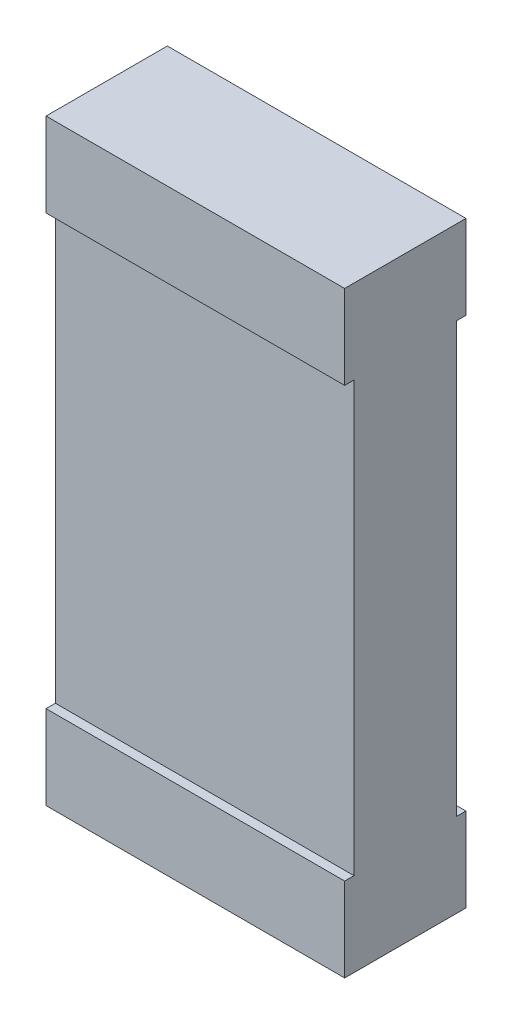
ISO-10303-21;
HEADER;
FILE_DESCRIPTION(('STEP AP214'),'2;1');
FILE_NAME('part.step','',(''),(''),'','','');
FILE_SCHEMA(('AUTOMOTIVE_DESIGN { 1 0 10303 214 1 1 1 1 }'));
ENDSEC;
DATA;
#1=APPLICATION_CONTEXT('core data for automotive mechanical design processes');
#2=APPLICATION_PROTOCOL_DEFINITION('international standard','automotive_design',2000,#1);
#3=PRODUCT_CONTEXT('',#1,'mechanical');
#4=PRODUCT('Part','Part','',(#3));
#5=PRODUCT_RELATED_PRODUCT_CATEGORY('part','',(#4));
#6=PRODUCT_DEFINITION_FORMATION('','',#4);
#7=PRODUCT_DEFINITION_CONTEXT('part definition',#1,'design');
#8=PRODUCT_DEFINITION('design','',#6,#7);
#9=PRODUCT_DEFINITION_SHAPE('','',#8);
#10=(LENGTH_UNIT() NAMED_UNIT(*) SI_UNIT(.MILLI.,.METRE.));
#11=(NAMED_UNIT(*) PLANE_ANGLE_UNIT() SI_UNIT($,.RADIAN.));
#12=(NAMED_UNIT(*) SI_UNIT($,.STERADIAN.) SOLID_ANGLE_UNIT());
#13=UNCERTAINTY_MEASURE_WITH_UNIT(LENGTH_MEASURE(1.E-05),#10,'distance_accuracy_value','');
#14=(GEOMETRIC_REPRESENTATION_CONTEXT(3) GLOBAL_UNCERTAINTY_ASSIGNED_CONTEXT((#13)) GLOBAL_UNIT_ASSIGNED_CONTEXT((#10,
#11,#12)) REPRESENTATION_CONTEXT('',''));
#15=CARTESIAN_POINT('',(0.,0.,0.));
#16=DIRECTION('',(0.,0.,1.));
#17=DIRECTION('',(1.,0.,0.));
#18=AXIS2_PLACEMENT_3D('',#15,#16,#17);
#19=CARTESIAN_POINT('',(-0.8,0.,0.65));
#20=DIRECTION('',(0.,0.,1.));
#21=DIRECTION('',(1.,0.,0.));
#22=AXIS2_PLACEMENT_3D('',#19,#20,#21);
#23=PLANE('',#22);
#24=DIRECTION('',(1.,0.,0.));
#25=VECTOR('',#24,1.);
#26=CARTESIAN_POINT('',(-0.800000000000001,3.2,0.65));
#27=LINE('',#26,#25);
#28=CARTESIAN_POINT('',(0.800000000000001,3.2,0.65));
#29=VERTEX_POINT('',#28);
#30=CARTESIAN_POINT('',(-0.800000000000001,3.2,0.65));
#31=VERTEX_POINT('',#30);
#32=EDGE_CURVE('E116',#29,#31,#27,.F.);
#33=ORIENTED_EDGE('',*,*,#32,.T.);
#34=DIRECTION('',(0.,1.,0.));
#35=VECTOR('',#34,1.);
#36=CARTESIAN_POINT('',(-0.800000000000001,0.,0.65));
#37=LINE('',#36,#35);
#38=CARTESIAN_POINT('',(-0.800000000000001,2.75,0.65));
#39=VERTEX_POINT('',#38);
#40=EDGE_CURVE('E102',#31,#39,#37,.F.);
#41=ORIENTED_EDGE('',*,*,#40,.T.);
#42=DIRECTION('',(1.,0.,0.));
#43=VECTOR('',#42,1.);
#44=CARTESIAN_POINT('',(-0.800000000000001,2.75,0.65));
#45=LINE('',#44,#43);
#46=CARTESIAN_POINT('',(0.800000000000001,2.75,0.65));
#47=VERTEX_POINT('',#46);
#48=EDGE_CURVE('E122',#39,#47,#45,.T.);
#49=ORIENTED_EDGE('',*,*,#48,.T.);
#50=DIRECTION('',(0.,1.,0.));
#51=VECTOR('',#50,1.);
#52=CARTESIAN_POINT('',(0.800000000000001,0.,0.65));
#53=LINE('',#52,#51);
#54=EDGE_CURVE('E19',#47,#29,#53,.T.);
#55=ORIENTED_EDGE('',*,*,#54,.T.);
#56=EDGE_LOOP('',(#33,#41,#49,#55));
#57=FACE_BOUND('',#56,.T.);
#58=ADVANCED_FACE('F16',(#57),#23,.T.);
#59=CARTESIAN_POINT('',(-0.8,0.,0.65));
#60=DIRECTION('',(0.,0.,1.));
#61=DIRECTION('',(1.,0.,0.));
#62=AXIS2_PLACEMENT_3D('',#59,#60,#61);
#63=PLANE('',#62);
#64=DIRECTION('',(1.,0.,0.));
#65=VECTOR('',#64,1.);
#66=CARTESIAN_POINT('',(-0.8,0.,0.65));
#67=LINE('',#66,#65);
#68=CARTESIAN_POINT('',(-0.800000000000001,0.,0.65));
#69=VERTEX_POINT('',#68);
#70=CARTESIAN_POINT('',(0.8,0.,0.65));
#71=VERTEX_POINT('',#70);
#72=EDGE_CURVE('E166',#69,#71,#67,.T.);
#73=ORIENTED_EDGE('',*,*,#72,.T.);
#74=DIRECTION('',(0.,1.,0.));
#75=VECTOR('',#74,1.);
#76=CARTESIAN_POINT('',(0.8,0.,0.65));
#77=LINE('',#76,#75);
#78=CARTESIAN_POINT('',(0.8,0.45,0.65));
#79=VERTEX_POINT('',#78);
#80=EDGE_CURVE('E117',#71,#79,#77,.T.);
#81=ORIENTED_EDGE('',*,*,#80,.T.);
#82=DIRECTION('',(1.,0.,0.));
#83=VECTOR('',#82,1.);
#84=CARTESIAN_POINT('',(-0.800000000000001,0.45,0.65));
#85=LINE('',#84,#83);
#86=CARTESIAN_POINT('',(-0.800000000000001,0.45,0.65));
#87=VERTEX_POINT('',#86);
#88=EDGE_CURVE('E150',#79,#87,#85,.F.);
#89=ORIENTED_EDGE('',*,*,#88,.T.);
#90=DIRECTION('',(0.,1.,0.));
#91=VECTOR('',#90,1.);
#92=CARTESIAN_POINT('',(-0.800000000000001,0.,0.65));
#93=LINE('',#92,#91);
#94=EDGE_CURVE('E133',#87,#69,#93,.F.);
#95=ORIENTED_EDGE('',*,*,#94,.T.);
#96=EDGE_LOOP('',(#73,#81,#89,#95));
#97=FACE_BOUND('',#96,.T.);
#98=ADVANCED_FACE('F163',(#97),#63,.T.);
#99=CARTESIAN_POINT('',(-0.800000000000001,3.2,0.65));
#100=DIRECTION('',(0.,-1.,0.));
#101=DIRECTION('',(0.,0.,-1.));
#102=AXIS2_PLACEMENT_3D('',#99,#100,#101);
#103=PLANE('',#102);
#104=DIRECTION('',(0.,0.,-1.));
#105=VECTOR('',#104,1.);
#106=CARTESIAN_POINT('',(-0.800000000000001,3.2,0.65));
#107=LINE('',#106,#105);
#108=CARTESIAN_POINT('',(-0.800000000000001,3.2,0.));
#109=VERTEX_POINT('',#108);
#110=EDGE_CURVE('E125',#31,#109,#107,.T.);
#111=ORIENTED_EDGE('',*,*,#110,.F.);
#112=ORIENTED_EDGE('',*,*,#32,.F.);
#113=DIRECTION('',(0.,0.,-1.));
#114=VECTOR('',#113,1.);
#115=CARTESIAN_POINT('',(0.800000000000001,3.2,0.65));
#116=LINE('',#115,#114);
#117=CARTESIAN_POINT('',(0.800000000000001,3.2,0.));
#118=VERTEX_POINT('',#117);
#119=EDGE_CURVE('E106',#118,#29,#116,.F.);
#120=ORIENTED_EDGE('',*,*,#119,.F.);
#121=DIRECTION('',(1.,0.,0.));
#122=VECTOR('',#121,1.);
#123=CARTESIAN_POINT('',(-0.8,3.2,0.));
#124=LINE('',#123,#122);
#125=EDGE_CURVE('E177',#118,#109,#124,.F.);
#126=ORIENTED_EDGE('',*,*,#125,.T.);
#127=EDGE_LOOP('',(#111,#112,#120,#126));
#128=FACE_BOUND('',#127,.T.);
#129=ADVANCED_FACE('F124',(#128),#103,.F.);
#130=CARTESIAN_POINT('',(-0.800000000000001,0.45,1.04939769162652));
#131=DIRECTION('',(0.,-1.,0.));
#132=DIRECTION('',(0.,0.,-1.));
#133=AXIS2_PLACEMENT_3D('',#130,#131,#132);
#134=PLANE('',#133);
#135=DIRECTION('',(0.,0.,-1.));
#136=VECTOR('',#135,1.);
#137=CARTESIAN_POINT('',(-0.800000000000001,0.45,1.04939769162652));
#138=LINE('',#137,#136);
#139=CARTESIAN_POINT('',(-0.800000000000001,0.45,0.6));
#140=VERTEX_POINT('',#139);
#141=EDGE_CURVE('E147',#87,#140,#138,.T.);
#142=ORIENTED_EDGE('',*,*,#141,.F.);
#143=ORIENTED_EDGE('',*,*,#88,.F.);
#144=DIRECTION('',(0.,0.,-1.));
#145=VECTOR('',#144,1.);
#146=CARTESIAN_POINT('',(0.8,0.45,1.04939769162652));
#147=LINE('',#146,#145);
#148=CARTESIAN_POINT('',(0.8,0.45,0.6));
#149=VERTEX_POINT('',#148);
#150=EDGE_CURVE('E127',#149,#79,#147,.F.);
#151=ORIENTED_EDGE('',*,*,#150,.F.);
#152=DIRECTION('',(1.,0.,0.));
#153=VECTOR('',#152,1.);
#154=CARTESIAN_POINT('',(-3.16484671807709,0.45,0.6));
#155=LINE('',#154,#153);
#156=EDGE_CURVE('E169',#140,#149,#155,.T.);
#157=ORIENTED_EDGE('',*,*,#156,.F.);
#158=EDGE_LOOP('',(#142,#143,#151,#157));
#159=FACE_BOUND('',#158,.T.);
#160=ADVANCED_FACE('F168',(#159),#134,.F.);
#161=CARTESIAN_POINT('',(-0.800000000000001,2.75,1.04939769162652));
#162=DIRECTION('',(0.,1.,0.));
#163=DIRECTION('',(0.,0.,1.));
#164=AXIS2_PLACEMENT_3D('',#161,#162,#163);
#165=PLANE('',#164);
#166=DIRECTION('',(1.,0.,0.));
#167=VECTOR('',#166,1.);
#168=CARTESIAN_POINT('',(-3.16484671807709,2.75,0.6));
#169=LINE('',#168,#167);
#170=CARTESIAN_POINT('',(0.800000000000001,2.75,0.6));
#171=VERTEX_POINT('',#170);
#172=CARTESIAN_POINT('',(-0.800000000000001,2.75,0.6));
#173=VERTEX_POINT('',#172);
#174=EDGE_CURVE('E184',#171,#173,#169,.F.);
#175=ORIENTED_EDGE('',*,*,#174,.F.);
#176=DIRECTION('',(0.,0.,1.));
#177=VECTOR('',#176,1.);
#178=CARTESIAN_POINT('',(0.800000000000001,2.75,1.04939769162652));
#179=LINE('',#178,#177);
#180=EDGE_CURVE('E144',#47,#171,#179,.F.);
#181=ORIENTED_EDGE('',*,*,#180,.F.);
#182=ORIENTED_EDGE('',*,*,#48,.F.);
#183=DIRECTION('',(0.,0.,1.));
#184=VECTOR('',#183,1.);
#185=CARTESIAN_POINT('',(-0.800000000000001,2.75,1.04939769162652));
#186=LINE('',#185,#184);
#187=EDGE_CURVE('E136',#173,#39,#186,.T.);
#188=ORIENTED_EDGE('',*,*,#187,.F.);
#189=EDGE_LOOP('',(#175,#181,#182,#188));
#190=FACE_BOUND('',#189,.T.);
#191=ADVANCED_FACE('F146',(#190),#165,.F.);
#192=CARTESIAN_POINT('',(-0.8,0.,0.65));
#193=DIRECTION('',(0.,1.,0.));
#194=DIRECTION('',(0.,0.,1.));
#195=AXIS2_PLACEMENT_3D('',#192,#193,#194);
#196=PLANE('',#195);
#197=DIRECTION('',(0.,0.,1.));
#198=VECTOR('',#197,1.);
#199=CARTESIAN_POINT('',(0.8,0.,0.65));
#200=LINE('',#199,#198);
#201=CARTESIAN_POINT('',(0.8,0.,0.));
#202=VERTEX_POINT('',#201);
#203=EDGE_CURVE('E175',#71,#202,#200,.F.);
#204=ORIENTED_EDGE('',*,*,#203,.F.);
#205=ORIENTED_EDGE('',*,*,#72,.F.);
#206=DIRECTION('',(0.,0.,1.));
#207=VECTOR('',#206,1.);
#208=CARTESIAN_POINT('',(-0.8,0.,0.65));
#209=LINE('',#208,#207);
#210=CARTESIAN_POINT('',(-0.8,0.,0.));
#211=VERTEX_POINT('',#210);
#212=EDGE_CURVE('E143',#211,#69,#209,.T.);
#213=ORIENTED_EDGE('',*,*,#212,.F.);
#214=DIRECTION('',(1.,0.,0.));
#215=VECTOR('',#214,1.);
#216=CARTESIAN_POINT('',(-0.8,0.,0.));
#217=LINE('',#216,#215);
#218=EDGE_CURVE('E186',#211,#202,#217,.T.);
#219=ORIENTED_EDGE('',*,*,#218,.T.);
#220=EDGE_LOOP('',(#204,#205,#213,#219));
#221=FACE_BOUND('',#220,.T.);
#222=ADVANCED_FACE('F172',(#221),#196,.F.);
#223=CARTESIAN_POINT('',(-0.8,0.,0.));
#224=DIRECTION('',(0.,0.,1.));
#225=DIRECTION('',(1.,0.,0.));
#226=AXIS2_PLACEMENT_3D('',#223,#224,#225);
#227=PLANE('',#226);
#228=DIRECTION('',(1.,0.,0.));
#229=VECTOR('',#228,1.);
#230=CARTESIAN_POINT('',(-0.800000000000001,2.75,0.));
#231=LINE('',#230,#229);
#232=CARTESIAN_POINT('',(0.800000000000001,2.75,0.));
#233=VERTEX_POINT('',#232);
#234=CARTESIAN_POINT('',(-0.800000000000001,2.75,0.));
#235=VERTEX_POINT('',#234);
#236=EDGE_CURVE('E194',#233,#235,#231,.F.);
#237=ORIENTED_EDGE('',*,*,#236,.T.);
#238=DIRECTION('',(0.,1.,0.));
#239=VECTOR('',#238,1.);
#240=CARTESIAN_POINT('',(-0.800000000000001,3.2,0.));
#241=LINE('',#240,#239);
#242=EDGE_CURVE('E190',#235,#109,#241,.T.);
#243=ORIENTED_EDGE('',*,*,#242,.T.);
#244=ORIENTED_EDGE('',*,*,#125,.F.);
#245=DIRECTION('',(0.,1.,0.));
#246=VECTOR('',#245,1.);
#247=CARTESIAN_POINT('',(0.800000000000001,0.,0.));
#248=LINE('',#247,#246);
#249=EDGE_CURVE('E111',#233,#118,#248,.T.);
#250=ORIENTED_EDGE('',*,*,#249,.F.);
#251=EDGE_LOOP('',(#237,#243,#244,#250));
#252=FACE_BOUND('',#251,.T.);
#253=ADVANCED_FACE('F226',(#252),#227,.F.);
#254=CARTESIAN_POINT('',(-3.16484671807709,0.45,0.6));
#255=DIRECTION('',(0.,0.,1.));
#256=DIRECTION('',(1.,0.,0.));
#257=AXIS2_PLACEMENT_3D('',#254,#255,#256);
#258=PLANE('',#257);
#259=DIRECTION('',(0.,-1.,0.));
#260=VECTOR('',#259,1.);
#261=CARTESIAN_POINT('',(0.800000000000001,3.2,0.6));
#262=LINE('',#261,#260);
#263=EDGE_CURVE('E157',#149,#171,#262,.F.);
#264=ORIENTED_EDGE('',*,*,#263,.T.);
#265=ORIENTED_EDGE('',*,*,#174,.T.);
#266=DIRECTION('',(0.,1.,0.));
#267=VECTOR('',#266,1.);
#268=CARTESIAN_POINT('',(-0.800000000000001,3.2,0.6));
#269=LINE('',#268,#267);
#270=EDGE_CURVE('E139',#173,#140,#269,.F.);
#271=ORIENTED_EDGE('',*,*,#270,.T.);
#272=ORIENTED_EDGE('',*,*,#156,.T.);
#273=EDGE_LOOP('',(#264,#265,#271,#272));
#274=FACE_BOUND('',#273,.T.);
#275=ADVANCED_FACE('F234',(#274),#258,.T.);
#276=CARTESIAN_POINT('',(-0.8,0.,0.));
#277=DIRECTION('',(0.,0.,1.));
#278=DIRECTION('',(1.,0.,0.));
#279=AXIS2_PLACEMENT_3D('',#276,#277,#278);
#280=PLANE('',#279);
#281=DIRECTION('',(1.,0.,0.));
#282=VECTOR('',#281,1.);
#283=CARTESIAN_POINT('',(-0.800000000000001,0.45,0.));
#284=LINE('',#283,#282);
#285=CARTESIAN_POINT('',(-0.800000000000001,0.45,0.));
#286=VERTEX_POINT('',#285);
#287=CARTESIAN_POINT('',(0.8,0.45,0.));
#288=VERTEX_POINT('',#287);
#289=EDGE_CURVE('E204',#286,#288,#284,.T.);
#290=ORIENTED_EDGE('',*,*,#289,.T.);
#291=DIRECTION('',(0.,-1.,0.));
#292=VECTOR('',#291,1.);
#293=CARTESIAN_POINT('',(0.800000000000001,3.2,0.));
#294=LINE('',#293,#292);
#295=EDGE_CURVE('E201',#288,#202,#294,.T.);
#296=ORIENTED_EDGE('',*,*,#295,.T.);
#297=ORIENTED_EDGE('',*,*,#218,.F.);
#298=DIRECTION('',(0.,1.,0.));
#299=VECTOR('',#298,1.);
#300=CARTESIAN_POINT('',(-0.800000000000001,3.2,0.));
#301=LINE('',#300,#299);
#302=EDGE_CURVE('E188',#211,#286,#301,.T.);
#303=ORIENTED_EDGE('',*,*,#302,.T.);
#304=EDGE_LOOP('',(#290,#296,#297,#303));
#305=FACE_BOUND('',#304,.T.);
#306=ADVANCED_FACE('F232',(#305),#280,.F.);
#307=CARTESIAN_POINT('',(-0.800000000000001,3.2,0.65));
#308=DIRECTION('',(1.,0.,0.));
#309=DIRECTION('',(0.,1.,0.));
#310=AXIS2_PLACEMENT_3D('',#307,#308,#309);
#311=PLANE('',#310);
#312=ORIENTED_EDGE('',*,*,#141,.T.);
#313=ORIENTED_EDGE('',*,*,#270,.F.);
#314=ORIENTED_EDGE('',*,*,#187,.T.);
#315=ORIENTED_EDGE('',*,*,#40,.F.);
#316=ORIENTED_EDGE('',*,*,#110,.T.);
#317=ORIENTED_EDGE('',*,*,#242,.F.);
#318=DIRECTION('',(0.,0.,1.));
#319=VECTOR('',#318,1.);
#320=CARTESIAN_POINT('',(-0.800000000000001,2.75,1.04939769162652));
#321=LINE('',#320,#319);
#322=CARTESIAN_POINT('',(-0.800000000000001,2.75,0.0499999999999999));
#323=VERTEX_POINT('',#322);
#324=EDGE_CURVE('E196',#235,#323,#321,.T.);
#325=ORIENTED_EDGE('',*,*,#324,.T.);
#326=DIRECTION('',(0.,1.,0.));
#327=VECTOR('',#326,1.);
#328=CARTESIAN_POINT('',(-0.800000000000001,0.45,0.05));
#329=LINE('',#328,#327);
#330=CARTESIAN_POINT('',(-0.800000000000001,0.45,0.0499999999999999));
#331=VERTEX_POINT('',#330);
#332=EDGE_CURVE('E210',#331,#323,#329,.T.);
#333=ORIENTED_EDGE('',*,*,#332,.F.);
#334=DIRECTION('',(0.,0.,-1.));
#335=VECTOR('',#334,1.);
#336=CARTESIAN_POINT('',(-0.800000000000001,0.45,1.04939769162652));
#337=LINE('',#336,#335);
#338=EDGE_CURVE('E207',#331,#286,#337,.T.);
#339=ORIENTED_EDGE('',*,*,#338,.T.);
#340=ORIENTED_EDGE('',*,*,#302,.F.);
#341=ORIENTED_EDGE('',*,*,#212,.T.);
#342=ORIENTED_EDGE('',*,*,#94,.F.);
#343=EDGE_LOOP('',(#312,#313,#314,#315,#316,#317,#325,#333,#339,#340,#341,#342));
#344=FACE_BOUND('',#343,.T.);
#345=ADVANCED_FACE('F137',(#344),#311,.F.);
#346=CARTESIAN_POINT('',(-0.800000000000001,2.75,1.04939769162652));
#347=DIRECTION('',(0.,1.,0.));
#348=DIRECTION('',(0.,0.,1.));
#349=AXIS2_PLACEMENT_3D('',#346,#347,#348);
#350=PLANE('',#349);
#351=ORIENTED_EDGE('',*,*,#324,.F.);
#352=ORIENTED_EDGE('',*,*,#236,.F.);
#353=DIRECTION('',(0.,0.,1.));
#354=VECTOR('',#353,1.);
#355=CARTESIAN_POINT('',(0.800000000000001,2.75,0.65));
#356=LINE('',#355,#354);
#357=CARTESIAN_POINT('',(0.800000000000001,2.75,0.05));
#358=VERTEX_POINT('',#357);
#359=EDGE_CURVE('E199',#233,#358,#356,.T.);
#360=ORIENTED_EDGE('',*,*,#359,.T.);
#361=DIRECTION('',(1.,0.,0.));
#362=VECTOR('',#361,1.);
#363=CARTESIAN_POINT('',(-3.16484671807709,2.75,0.05));
#364=LINE('',#363,#362);
#365=EDGE_CURVE('E213',#323,#358,#364,.T.);
#366=ORIENTED_EDGE('',*,*,#365,.F.);
#367=EDGE_LOOP('',(#351,#352,#360,#366));
#368=FACE_BOUND('',#367,.T.);
#369=ADVANCED_FACE('F223',(#368),#350,.F.);
#370=CARTESIAN_POINT('',(0.800000000000001,3.2,0.65));
#371=DIRECTION('',(-1.,0.,0.));
#372=DIRECTION('',(0.,-1.,0.));
#373=AXIS2_PLACEMENT_3D('',#370,#371,#372);
#374=PLANE('',#373);
#375=DIRECTION('',(0.,0.,-1.));
#376=VECTOR('',#375,1.);
#377=CARTESIAN_POINT('',(0.8,0.45,1.04939769162652));
#378=LINE('',#377,#376);
#379=CARTESIAN_POINT('',(0.800000000000001,0.45,0.05));
#380=VERTEX_POINT('',#379);
#381=EDGE_CURVE('E34',#288,#380,#378,.F.);
#382=ORIENTED_EDGE('',*,*,#381,.T.);
#383=DIRECTION('',(0.,1.,0.));
#384=VECTOR('',#383,1.);
#385=CARTESIAN_POINT('',(0.800000000000001,0.45,0.05));
#386=LINE('',#385,#384);
#387=EDGE_CURVE('E25',#358,#380,#386,.F.);
#388=ORIENTED_EDGE('',*,*,#387,.F.);
#389=ORIENTED_EDGE('',*,*,#359,.F.);
#390=ORIENTED_EDGE('',*,*,#249,.T.);
#391=ORIENTED_EDGE('',*,*,#119,.T.);
#392=ORIENTED_EDGE('',*,*,#54,.F.);
#393=ORIENTED_EDGE('',*,*,#180,.T.);
#394=ORIENTED_EDGE('',*,*,#263,.F.);
#395=ORIENTED_EDGE('',*,*,#150,.T.);
#396=ORIENTED_EDGE('',*,*,#80,.F.);
#397=ORIENTED_EDGE('',*,*,#203,.T.);
#398=ORIENTED_EDGE('',*,*,#295,.F.);
#399=EDGE_LOOP('',(#382,#388,#389,#390,#391,#392,#393,#394,#395,#396,#397,#398));
#400=FACE_BOUND('',#399,.T.);
#401=ADVANCED_FACE('F108',(#400),#374,.F.);
#402=CARTESIAN_POINT('',(-0.800000000000001,0.45,1.04939769162652));
#403=DIRECTION('',(0.,-1.,0.));
#404=DIRECTION('',(0.,0.,-1.));
#405=AXIS2_PLACEMENT_3D('',#402,#403,#404);
#406=PLANE('',#405);
#407=DIRECTION('',(1.,0.,0.));
#408=VECTOR('',#407,1.);
#409=CARTESIAN_POINT('',(-3.16484671807709,0.45,0.05));
#410=LINE('',#409,#408);
#411=EDGE_CURVE('E11',#380,#331,#410,.F.);
#412=ORIENTED_EDGE('',*,*,#411,.F.);
#413=ORIENTED_EDGE('',*,*,#381,.F.);
#414=ORIENTED_EDGE('',*,*,#289,.F.);
#415=ORIENTED_EDGE('',*,*,#338,.F.);
#416=EDGE_LOOP('',(#412,#413,#414,#415));
#417=FACE_BOUND('',#416,.T.);
#418=ADVANCED_FACE('F230',(#417),#406,.F.);
#419=CARTESIAN_POINT('',(-3.16484671807709,0.45,0.05));
#420=DIRECTION('',(0.,0.,-1.));
#421=DIRECTION('',(0.,1.,0.));
#422=AXIS2_PLACEMENT_3D('',#419,#420,#421);
#423=PLANE('',#422);
#424=ORIENTED_EDGE('',*,*,#387,.T.);
#425=ORIENTED_EDGE('',*,*,#411,.T.);
#426=ORIENTED_EDGE('',*,*,#332,.T.);
#427=ORIENTED_EDGE('',*,*,#365,.T.);
#428=EDGE_LOOP('',(#424,#425,#426,#427));
#429=FACE_BOUND('',#428,.T.);
#430=ADVANCED_FACE('F218',(#429),#423,.T.);
#431=CLOSED_SHELL('',(#58,#98,#129,#160,#191,#222,#253,#275,#306,#345,#369,#401,#418,#430));
#432=MANIFOLD_SOLID_BREP('B1',#431);
#433=ADVANCED_BREP_SHAPE_REPRESENTATION('',(#18,#432),#14);
#434=SHAPE_DEFINITION_REPRESENTATION(#9,#433);
ENDSEC;
END-ISO-10303-21;
